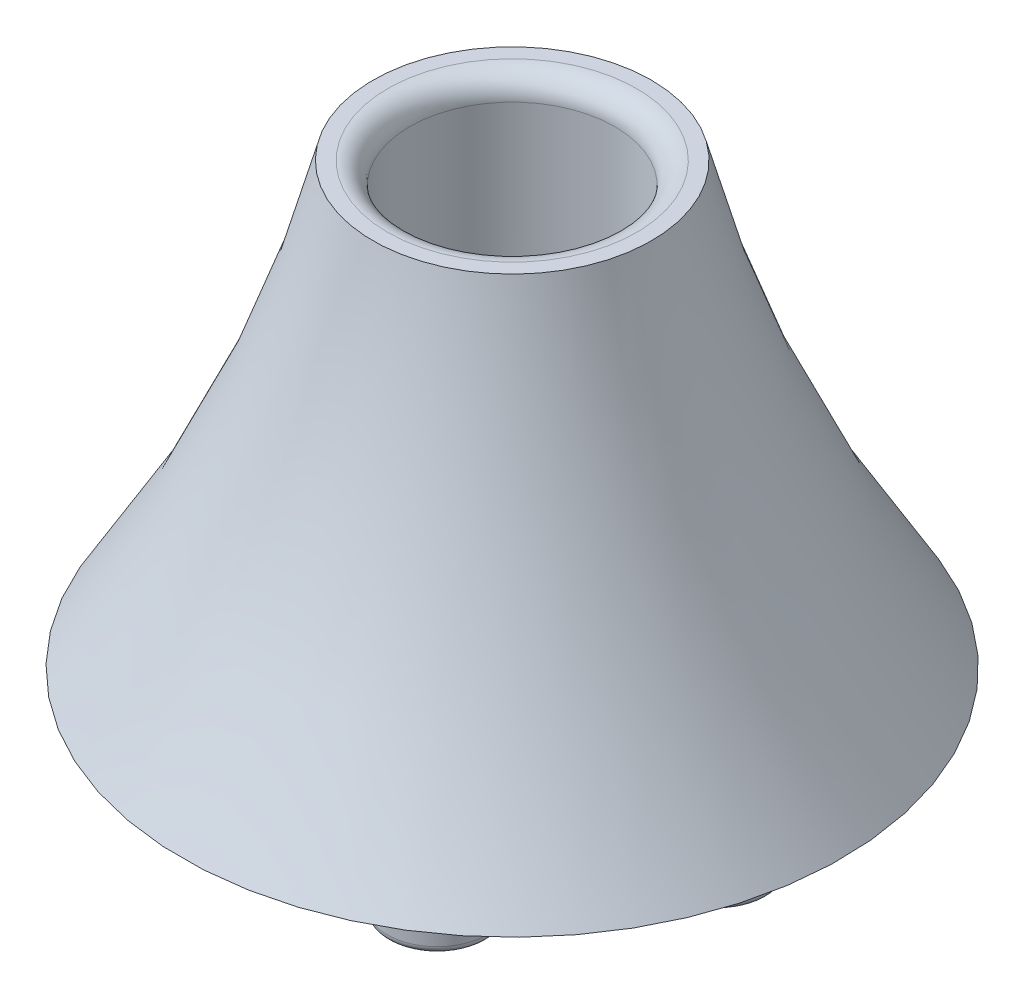
ISO-10303-21;
HEADER;
FILE_DESCRIPTION(('STEP AP214'),'2;1');
FILE_NAME('part.step','',(''),(''),'','','');
FILE_SCHEMA(('AUTOMOTIVE_DESIGN { 1 0 10303 214 1 1 1 1 }'));
ENDSEC;
DATA;
#1=APPLICATION_CONTEXT('core data for automotive mechanical design processes');
#2=APPLICATION_PROTOCOL_DEFINITION('international standard','automotive_design',2000,#1);
#3=PRODUCT_CONTEXT('',#1,'mechanical');
#4=PRODUCT('Part','Part','',(#3));
#5=PRODUCT_RELATED_PRODUCT_CATEGORY('part','',(#4));
#6=PRODUCT_DEFINITION_FORMATION('','',#4);
#7=PRODUCT_DEFINITION_CONTEXT('part definition',#1,'design');
#8=PRODUCT_DEFINITION('design','',#6,#7);
#9=PRODUCT_DEFINITION_SHAPE('','',#8);
#10=(LENGTH_UNIT() NAMED_UNIT(*) SI_UNIT(.MILLI.,.METRE.));
#11=(NAMED_UNIT(*) PLANE_ANGLE_UNIT() SI_UNIT($,.RADIAN.));
#12=(NAMED_UNIT(*) SI_UNIT($,.STERADIAN.) SOLID_ANGLE_UNIT());
#13=UNCERTAINTY_MEASURE_WITH_UNIT(LENGTH_MEASURE(1.E-05),#10,'distance_accuracy_value','');
#14=(GEOMETRIC_REPRESENTATION_CONTEXT(3) GLOBAL_UNCERTAINTY_ASSIGNED_CONTEXT((#13)) GLOBAL_UNIT_ASSIGNED_CONTEXT((#10,
#11,#12)) REPRESENTATION_CONTEXT('',''));
#15=CARTESIAN_POINT('',(0.,0.,0.));
#16=DIRECTION('',(0.,0.,1.));
#17=DIRECTION('',(1.,0.,0.));
#18=AXIS2_PLACEMENT_3D('',#15,#16,#17);
#19=CARTESIAN_POINT('',(0.,30.,0.));
#20=DIRECTION('',(0.,1.,0.));
#21=DIRECTION('',(0.,0.,1.));
#22=AXIS2_PLACEMENT_3D('',#19,#20,#21);
#23=PLANE('',#22);
#24=CARTESIAN_POINT('',(0.,30.,0.));
#25=DIRECTION('',(0.,1.,0.));
#26=DIRECTION('',(0.,0.,1.));
#27=AXIS2_PLACEMENT_3D('',#24,#25,#26);
#28=CIRCLE('',#27,8.5);
#29=CARTESIAN_POINT('',(0.,30.,8.5));
#30=VERTEX_POINT('',#29);
#31=EDGE_CURVE('E85',#30,#30,#28,.F.);
#32=ORIENTED_EDGE('',*,*,#31,.T.);
#33=EDGE_LOOP('',(#32));
#34=FACE_BOUND('',#33,.T.);
#35=CARTESIAN_POINT('',(0.,30.,0.));
#36=DIRECTION('',(0.,-1.,0.));
#37=DIRECTION('',(0.,0.,-1.));
#38=AXIS2_PLACEMENT_3D('',#35,#36,#37);
#39=CIRCLE('',#38,9.5);
#40=CARTESIAN_POINT('',(0.,30.,-9.5));
#41=VERTEX_POINT('',#40);
#42=EDGE_CURVE('E88',#41,#41,#39,.T.);
#43=ORIENTED_EDGE('',*,*,#42,.F.);
#44=EDGE_LOOP('',(#43));
#45=FACE_BOUND('',#44,.T.);
#46=ADVANCED_FACE('F32',(#34,#45),#23,.T.);
#47=CARTESIAN_POINT('',(0.,51.750888593495,0.));
#48=DIRECTION('',(0.,-1.,0.));
#49=DIRECTION('',(0.,0.,-1.));
#50=AXIS2_PLACEMENT_3D('',#47,#48,#49);
#51=TOROIDAL_SURFACE('',#50,100.809742908065,93.8646382006751);
#52=CARTESIAN_POINT('',(0.,0.,0.));
#53=DIRECTION('',(0.,-1.,0.));
#54=DIRECTION('',(0.,0.,-1.));
#55=AXIS2_PLACEMENT_3D('',#52,#53,#54);
#56=CIRCLE('',#55,22.5);
#57=CARTESIAN_POINT('',(0.,0.,-22.5));
#58=VERTEX_POINT('',#57);
#59=EDGE_CURVE('E91',#58,#58,#56,.T.);
#60=ORIENTED_EDGE('',*,*,#59,.F.);
#61=EDGE_LOOP('',(#60));
#62=FACE_BOUND('',#61,.T.);
#63=ORIENTED_EDGE('',*,*,#42,.T.);
#64=EDGE_LOOP('',(#63));
#65=FACE_BOUND('',#64,.T.);
#66=ADVANCED_FACE('F119',(#62,#65),#51,.F.);
#67=CARTESIAN_POINT('',(0.,0.,0.));
#68=DIRECTION('',(0.,-1.,0.));
#69=DIRECTION('',(0.,0.,-1.));
#70=AXIS2_PLACEMENT_3D('',#67,#68,#69);
#71=PLANE('',#70);
#72=CARTESIAN_POINT('',(0.,0.,0.));
#73=DIRECTION('',(0.,-1.,0.));
#74=DIRECTION('',(0.,0.,-1.));
#75=AXIS2_PLACEMENT_3D('',#72,#73,#74);
#76=CIRCLE('',#75,8.5);
#77=CARTESIAN_POINT('',(0.,0.,-8.5));
#78=VERTEX_POINT('',#77);
#79=EDGE_CURVE('E76',#78,#78,#76,.F.);
#80=ORIENTED_EDGE('',*,*,#79,.T.);
#81=EDGE_LOOP('',(#80));
#82=FACE_BOUND('',#81,.T.);
#83=CARTESIAN_POINT('',(6.99999999999997,0.,-12.1243556529822));
#84=DIRECTION('',(0.,-1.,0.));
#85=DIRECTION('',(0.,0.,-1.));
#86=AXIS2_PLACEMENT_3D('',#83,#84,#85);
#87=CIRCLE('',#86,3.4);
#88=CARTESIAN_POINT('',(6.99999999999997,0.,-15.5243556529822));
#89=VERTEX_POINT('',#88);
#90=EDGE_CURVE('E109',#89,#89,#87,.T.);
#91=ORIENTED_EDGE('',*,*,#90,.F.);
#92=EDGE_LOOP('',(#91));
#93=FACE_BOUND('',#92,.T.);
#94=CARTESIAN_POINT('',(-7.00000000000006,0.,-12.1243556529821));
#95=DIRECTION('',(0.,-1.,0.));
#96=DIRECTION('',(0.,0.,-1.));
#97=AXIS2_PLACEMENT_3D('',#94,#95,#96);
#98=CIRCLE('',#97,3.4);
#99=CARTESIAN_POINT('',(-7.00000000000006,0.,-15.5243556529821));
#100=VERTEX_POINT('',#99);
#101=EDGE_CURVE('E106',#100,#100,#98,.T.);
#102=ORIENTED_EDGE('',*,*,#101,.F.);
#103=EDGE_LOOP('',(#102));
#104=FACE_BOUND('',#103,.T.);
#105=CARTESIAN_POINT('',(-14.,0.,0.));
#106=DIRECTION('',(0.,-1.,0.));
#107=DIRECTION('',(0.,0.,-1.));
#108=AXIS2_PLACEMENT_3D('',#105,#106,#107);
#109=CIRCLE('',#108,3.4);
#110=CARTESIAN_POINT('',(-14.,0.,-3.3999999999999));
#111=VERTEX_POINT('',#110);
#112=EDGE_CURVE('E103',#111,#111,#109,.T.);
#113=ORIENTED_EDGE('',*,*,#112,.F.);
#114=EDGE_LOOP('',(#113));
#115=FACE_BOUND('',#114,.T.);
#116=CARTESIAN_POINT('',(-6.99999999999989,0.,12.1243556529822));
#117=DIRECTION('',(0.,-1.,0.));
#118=DIRECTION('',(0.,0.,-1.));
#119=AXIS2_PLACEMENT_3D('',#116,#117,#118);
#120=CIRCLE('',#119,3.4);
#121=CARTESIAN_POINT('',(-6.99999999999989,0.,8.72435565298221));
#122=VERTEX_POINT('',#121);
#123=EDGE_CURVE('E100',#122,#122,#120,.T.);
#124=ORIENTED_EDGE('',*,*,#123,.F.);
#125=EDGE_LOOP('',(#124));
#126=FACE_BOUND('',#125,.T.);
#127=CARTESIAN_POINT('',(7.00000000000014,0.,12.1243556529821));
#128=DIRECTION('',(0.,-1.,0.));
#129=DIRECTION('',(0.,0.,-1.));
#130=AXIS2_PLACEMENT_3D('',#127,#128,#129);
#131=CIRCLE('',#130,3.4);
#132=CARTESIAN_POINT('',(7.00000000000014,0.,8.72435565298206));
#133=VERTEX_POINT('',#132);
#134=EDGE_CURVE('E97',#133,#133,#131,.T.);
#135=ORIENTED_EDGE('',*,*,#134,.F.);
#136=EDGE_LOOP('',(#135));
#137=FACE_BOUND('',#136,.T.);
#138=CARTESIAN_POINT('',(14.,0.,0.));
#139=DIRECTION('',(0.,-1.,0.));
#140=DIRECTION('',(0.,0.,-1.));
#141=AXIS2_PLACEMENT_3D('',#138,#139,#140);
#142=CIRCLE('',#141,3.4);
#143=CARTESIAN_POINT('',(14.,0.,-3.4));
#144=VERTEX_POINT('',#143);
#145=EDGE_CURVE('E94',#144,#144,#142,.T.);
#146=ORIENTED_EDGE('',*,*,#145,.F.);
#147=EDGE_LOOP('',(#146));
#148=FACE_BOUND('',#147,.T.);
#149=ORIENTED_EDGE('',*,*,#59,.T.);
#150=EDGE_LOOP('',(#149));
#151=FACE_BOUND('',#150,.T.);
#152=ADVANCED_FACE('F115',(#82,#93,#104,#115,#126,#137,#148,#151),#71,.T.);
#153=CARTESIAN_POINT('',(0.,0.,0.));
#154=DIRECTION('',(0.,-1.,0.));
#155=DIRECTION('',(0.,0.,-1.));
#156=AXIS2_PLACEMENT_3D('',#153,#154,#155);
#157=CYLINDRICAL_SURFACE('',#156,7.);
#158=CARTESIAN_POINT('',(0.,1.5,0.));
#159=DIRECTION('',(0.,-1.,0.));
#160=DIRECTION('',(0.,0.,-1.));
#161=AXIS2_PLACEMENT_3D('',#158,#159,#160);
#162=CIRCLE('',#161,7.);
#163=CARTESIAN_POINT('',(0.,1.5,-7.));
#164=VERTEX_POINT('',#163);
#165=EDGE_CURVE('E79',#164,#164,#162,.T.);
#166=ORIENTED_EDGE('',*,*,#165,.T.);
#167=EDGE_LOOP('',(#166));
#168=FACE_BOUND('',#167,.T.);
#169=CARTESIAN_POINT('',(0.,28.5,0.));
#170=DIRECTION('',(0.,1.,0.));
#171=DIRECTION('',(0.,0.,1.));
#172=AXIS2_PLACEMENT_3D('',#169,#170,#171);
#173=CIRCLE('',#172,7.);
#174=CARTESIAN_POINT('',(0.,28.5,7.));
#175=VERTEX_POINT('',#174);
#176=EDGE_CURVE('E82',#175,#175,#173,.T.);
#177=ORIENTED_EDGE('',*,*,#176,.T.);
#178=EDGE_LOOP('',(#177));
#179=FACE_BOUND('',#178,.T.);
#180=ADVANCED_FACE('F118',(#168,#179),#157,.F.);
#181=CARTESIAN_POINT('',(14.,-5.,0.));
#182=DIRECTION('',(0.,1.,0.));
#183=DIRECTION('',(0.,0.,1.));
#184=AXIS2_PLACEMENT_3D('',#181,#182,#183);
#185=CYLINDRICAL_SURFACE('',#184,3.4);
#186=CARTESIAN_POINT('',(14.,-4.5,0.));
#187=DIRECTION('',(0.,-1.,0.));
#188=DIRECTION('',(0.,0.,-1.));
#189=AXIS2_PLACEMENT_3D('',#186,#187,#188);
#190=CIRCLE('',#189,3.4);
#191=CARTESIAN_POINT('',(14.,-4.5,-3.4));
#192=VERTEX_POINT('',#191);
#193=EDGE_CURVE('E58',#192,#192,#190,.F.);
#194=ORIENTED_EDGE('',*,*,#193,.T.);
#195=EDGE_LOOP('',(#194));
#196=FACE_BOUND('',#195,.T.);
#197=ORIENTED_EDGE('',*,*,#145,.T.);
#198=EDGE_LOOP('',(#197));
#199=FACE_BOUND('',#198,.T.);
#200=ADVANCED_FACE('F219',(#196,#199),#185,.T.);
#201=CARTESIAN_POINT('',(0.,-5.,0.));
#202=DIRECTION('',(0.,-1.,0.));
#203=DIRECTION('',(0.,0.,-1.));
#204=AXIS2_PLACEMENT_3D('',#201,#202,#203);
#205=PLANE('',#204);
#206=CARTESIAN_POINT('',(14.,-5.,0.));
#207=DIRECTION('',(0.,-1.,0.));
#208=DIRECTION('',(0.,0.,-1.));
#209=AXIS2_PLACEMENT_3D('',#206,#207,#208);
#210=CIRCLE('',#209,2.9);
#211=CARTESIAN_POINT('',(14.,-5.,-2.9));
#212=VERTEX_POINT('',#211);
#213=EDGE_CURVE('E61',#212,#212,#210,.T.);
#214=ORIENTED_EDGE('',*,*,#213,.T.);
#215=EDGE_LOOP('',(#214));
#216=FACE_BOUND('',#215,.T.);
#217=ADVANCED_FACE('F215',(#216),#205,.T.);
#218=CARTESIAN_POINT('',(7.00000000000014,-5.,12.1243556529821));
#219=DIRECTION('',(0.,1.,0.));
#220=DIRECTION('',(0.,0.,1.));
#221=AXIS2_PLACEMENT_3D('',#218,#219,#220);
#222=CYLINDRICAL_SURFACE('',#221,3.4);
#223=CARTESIAN_POINT('',(7.00000000000014,-4.5,12.1243556529821));
#224=DIRECTION('',(0.,-1.,0.));
#225=DIRECTION('',(0.,0.,-1.));
#226=AXIS2_PLACEMENT_3D('',#223,#224,#225);
#227=CIRCLE('',#226,3.4);
#228=CARTESIAN_POINT('',(7.00000000000014,-4.5,8.72435565298206));
#229=VERTEX_POINT('',#228);
#230=EDGE_CURVE('E64',#229,#229,#227,.F.);
#231=ORIENTED_EDGE('',*,*,#230,.T.);
#232=EDGE_LOOP('',(#231));
#233=FACE_BOUND('',#232,.T.);
#234=ORIENTED_EDGE('',*,*,#134,.T.);
#235=EDGE_LOOP('',(#234));
#236=FACE_BOUND('',#235,.T.);
#237=ADVANCED_FACE('F211',(#233,#236),#222,.T.);
#238=CARTESIAN_POINT('',(0.,-5.,0.));
#239=DIRECTION('',(0.,-1.,0.));
#240=DIRECTION('',(0.,0.,-1.));
#241=AXIS2_PLACEMENT_3D('',#238,#239,#240);
#242=PLANE('',#241);
#243=CARTESIAN_POINT('',(7.00000000000014,-5.,12.1243556529821));
#244=DIRECTION('',(0.,-1.,0.));
#245=DIRECTION('',(0.,0.,-1.));
#246=AXIS2_PLACEMENT_3D('',#243,#244,#245);
#247=CIRCLE('',#246,2.9);
#248=CARTESIAN_POINT('',(7.00000000000014,-5.,9.22435565298206));
#249=VERTEX_POINT('',#248);
#250=EDGE_CURVE('E67',#249,#249,#247,.T.);
#251=ORIENTED_EDGE('',*,*,#250,.T.);
#252=EDGE_LOOP('',(#251));
#253=FACE_BOUND('',#252,.T.);
#254=ADVANCED_FACE('F207',(#253),#242,.T.);
#255=CARTESIAN_POINT('',(-6.99999999999989,-5.,12.1243556529822));
#256=DIRECTION('',(0.,1.,0.));
#257=DIRECTION('',(0.,0.,1.));
#258=AXIS2_PLACEMENT_3D('',#255,#256,#257);
#259=CYLINDRICAL_SURFACE('',#258,3.4);
#260=CARTESIAN_POINT('',(-6.99999999999989,-4.5,12.1243556529822));
#261=DIRECTION('',(0.,-1.,0.));
#262=DIRECTION('',(0.,0.,-1.));
#263=AXIS2_PLACEMENT_3D('',#260,#261,#262);
#264=CIRCLE('',#263,3.4);
#265=CARTESIAN_POINT('',(-6.99999999999989,-4.5,8.72435565298221));
#266=VERTEX_POINT('',#265);
#267=EDGE_CURVE('E70',#266,#266,#264,.F.);
#268=ORIENTED_EDGE('',*,*,#267,.T.);
#269=EDGE_LOOP('',(#268));
#270=FACE_BOUND('',#269,.T.);
#271=ORIENTED_EDGE('',*,*,#123,.T.);
#272=EDGE_LOOP('',(#271));
#273=FACE_BOUND('',#272,.T.);
#274=ADVANCED_FACE('F203',(#270,#273),#259,.T.);
#275=CARTESIAN_POINT('',(0.,-5.,0.));
#276=DIRECTION('',(0.,-1.,0.));
#277=DIRECTION('',(0.,0.,-1.));
#278=AXIS2_PLACEMENT_3D('',#275,#276,#277);
#279=PLANE('',#278);
#280=CARTESIAN_POINT('',(-6.99999999999989,-5.,12.1243556529822));
#281=DIRECTION('',(0.,-1.,0.));
#282=DIRECTION('',(0.,0.,-1.));
#283=AXIS2_PLACEMENT_3D('',#280,#281,#282);
#284=CIRCLE('',#283,2.9);
#285=CARTESIAN_POINT('',(-6.99999999999989,-5.,9.22435565298221));
#286=VERTEX_POINT('',#285);
#287=EDGE_CURVE('E73',#286,#286,#284,.T.);
#288=ORIENTED_EDGE('',*,*,#287,.T.);
#289=EDGE_LOOP('',(#288));
#290=FACE_BOUND('',#289,.T.);
#291=ADVANCED_FACE('F200',(#290),#279,.T.);
#292=CARTESIAN_POINT('',(-14.,-5.,0.));
#293=DIRECTION('',(0.,1.,0.));
#294=DIRECTION('',(0.,0.,1.));
#295=AXIS2_PLACEMENT_3D('',#292,#293,#294);
#296=CYLINDRICAL_SURFACE('',#295,3.4);
#297=CARTESIAN_POINT('',(-14.,-4.5,0.));
#298=DIRECTION('',(0.,-1.,0.));
#299=DIRECTION('',(0.,0.,-1.));
#300=AXIS2_PLACEMENT_3D('',#297,#298,#299);
#301=CIRCLE('',#300,3.4);
#302=CARTESIAN_POINT('',(-14.,-4.5,-3.3999999999999));
#303=VERTEX_POINT('',#302);
#304=EDGE_CURVE('E10',#303,#303,#301,.F.);
#305=ORIENTED_EDGE('',*,*,#304,.T.);
#306=EDGE_LOOP('',(#305));
#307=FACE_BOUND('',#306,.T.);
#308=ORIENTED_EDGE('',*,*,#112,.T.);
#309=EDGE_LOOP('',(#308));
#310=FACE_BOUND('',#309,.T.);
#311=ADVANCED_FACE('F197',(#307,#310),#296,.T.);
#312=CARTESIAN_POINT('',(0.,-5.,0.));
#313=DIRECTION('',(0.,-1.,0.));
#314=DIRECTION('',(0.,0.,-1.));
#315=AXIS2_PLACEMENT_3D('',#312,#313,#314);
#316=PLANE('',#315);
#317=CARTESIAN_POINT('',(-14.,-5.,0.));
#318=DIRECTION('',(0.,-1.,0.));
#319=DIRECTION('',(0.,0.,-1.));
#320=AXIS2_PLACEMENT_3D('',#317,#318,#319);
#321=CIRCLE('',#320,2.9);
#322=CARTESIAN_POINT('',(-14.,-5.,-2.8999999999999));
#323=VERTEX_POINT('',#322);
#324=EDGE_CURVE('E39',#323,#323,#321,.T.);
#325=ORIENTED_EDGE('',*,*,#324,.T.);
#326=EDGE_LOOP('',(#325));
#327=FACE_BOUND('',#326,.T.);
#328=ADVANCED_FACE('F190',(#327),#316,.T.);
#329=CARTESIAN_POINT('',(-7.00000000000006,-5.,-12.1243556529821));
#330=DIRECTION('',(0.,1.,0.));
#331=DIRECTION('',(0.,0.,1.));
#332=AXIS2_PLACEMENT_3D('',#329,#330,#331);
#333=CYLINDRICAL_SURFACE('',#332,3.4);
#334=CARTESIAN_POINT('',(-7.00000000000006,-4.5,-12.1243556529821));
#335=DIRECTION('',(0.,-1.,0.));
#336=DIRECTION('',(0.,0.,-1.));
#337=AXIS2_PLACEMENT_3D('',#334,#335,#336);
#338=CIRCLE('',#337,3.4);
#339=CARTESIAN_POINT('',(-7.00000000000006,-4.5,-15.5243556529821));
#340=VERTEX_POINT('',#339);
#341=EDGE_CURVE('E43',#340,#340,#338,.F.);
#342=ORIENTED_EDGE('',*,*,#341,.T.);
#343=EDGE_LOOP('',(#342));
#344=FACE_BOUND('',#343,.T.);
#345=ORIENTED_EDGE('',*,*,#101,.T.);
#346=EDGE_LOOP('',(#345));
#347=FACE_BOUND('',#346,.T.);
#348=ADVANCED_FACE('F182',(#344,#347),#333,.T.);
#349=CARTESIAN_POINT('',(0.,-5.,0.));
#350=DIRECTION('',(0.,-1.,0.));
#351=DIRECTION('',(0.,0.,-1.));
#352=AXIS2_PLACEMENT_3D('',#349,#350,#351);
#353=PLANE('',#352);
#354=CARTESIAN_POINT('',(-7.00000000000006,-5.,-12.1243556529821));
#355=DIRECTION('',(0.,-1.,0.));
#356=DIRECTION('',(0.,0.,-1.));
#357=AXIS2_PLACEMENT_3D('',#354,#355,#356);
#358=CIRCLE('',#357,2.9);
#359=CARTESIAN_POINT('',(-7.00000000000006,-5.,-15.0243556529821));
#360=VERTEX_POINT('',#359);
#361=EDGE_CURVE('E47',#360,#360,#358,.T.);
#362=ORIENTED_EDGE('',*,*,#361,.T.);
#363=EDGE_LOOP('',(#362));
#364=FACE_BOUND('',#363,.T.);
#365=ADVANCED_FACE('F180',(#364),#353,.T.);
#366=CARTESIAN_POINT('',(6.99999999999997,-5.,-12.1243556529822));
#367=DIRECTION('',(0.,1.,0.));
#368=DIRECTION('',(0.,0.,1.));
#369=AXIS2_PLACEMENT_3D('',#366,#367,#368);
#370=CYLINDRICAL_SURFACE('',#369,3.4);
#371=CARTESIAN_POINT('',(6.99999999999997,-4.5,-12.1243556529822));
#372=DIRECTION('',(0.,-1.,0.));
#373=DIRECTION('',(0.,0.,-1.));
#374=AXIS2_PLACEMENT_3D('',#371,#372,#373);
#375=CIRCLE('',#374,3.4);
#376=CARTESIAN_POINT('',(6.99999999999997,-4.5,-15.5243556529822));
#377=VERTEX_POINT('',#376);
#378=EDGE_CURVE('E52',#377,#377,#375,.F.);
#379=ORIENTED_EDGE('',*,*,#378,.T.);
#380=EDGE_LOOP('',(#379));
#381=FACE_BOUND('',#380,.T.);
#382=ORIENTED_EDGE('',*,*,#90,.T.);
#383=EDGE_LOOP('',(#382));
#384=FACE_BOUND('',#383,.T.);
#385=ADVANCED_FACE('F113',(#381,#384),#370,.T.);
#386=CARTESIAN_POINT('',(0.,-5.,0.));
#387=DIRECTION('',(0.,-1.,0.));
#388=DIRECTION('',(0.,0.,-1.));
#389=AXIS2_PLACEMENT_3D('',#386,#387,#388);
#390=PLANE('',#389);
#391=CARTESIAN_POINT('',(6.99999999999997,-5.,-12.1243556529822));
#392=DIRECTION('',(0.,-1.,0.));
#393=DIRECTION('',(0.,0.,-1.));
#394=AXIS2_PLACEMENT_3D('',#391,#392,#393);
#395=CIRCLE('',#394,2.9);
#396=CARTESIAN_POINT('',(6.99999999999997,-5.,-15.0243556529822));
#397=VERTEX_POINT('',#396);
#398=EDGE_CURVE('E55',#397,#397,#395,.T.);
#399=ORIENTED_EDGE('',*,*,#398,.T.);
#400=EDGE_LOOP('',(#399));
#401=FACE_BOUND('',#400,.T.);
#402=ADVANCED_FACE('F149',(#401),#390,.T.);
#403=CARTESIAN_POINT('',(0.,28.5,0.));
#404=DIRECTION('',(0.,1.,0.));
#405=DIRECTION('',(0.,0.,1.));
#406=AXIS2_PLACEMENT_3D('',#403,#404,#405);
#407=TOROIDAL_SURFACE('',#406,8.5,1.5);
#408=ORIENTED_EDGE('',*,*,#176,.F.);
#409=EDGE_LOOP('',(#408));
#410=FACE_BOUND('',#409,.T.);
#411=ORIENTED_EDGE('',*,*,#31,.F.);
#412=EDGE_LOOP('',(#411));
#413=FACE_BOUND('',#412,.T.);
#414=ADVANCED_FACE('F145',(#410,#413),#407,.T.);
#415=CARTESIAN_POINT('',(0.,1.5,0.));
#416=DIRECTION('',(0.,-1.,0.));
#417=DIRECTION('',(0.,0.,-1.));
#418=AXIS2_PLACEMENT_3D('',#415,#416,#417);
#419=TOROIDAL_SURFACE('',#418,8.5,1.5);
#420=ORIENTED_EDGE('',*,*,#79,.F.);
#421=EDGE_LOOP('',(#420));
#422=FACE_BOUND('',#421,.T.);
#423=ORIENTED_EDGE('',*,*,#165,.F.);
#424=EDGE_LOOP('',(#423));
#425=FACE_BOUND('',#424,.T.);
#426=ADVANCED_FACE('F148',(#422,#425),#419,.T.);
#427=CARTESIAN_POINT('',(-6.99999999999989,-4.5,12.1243556529822));
#428=DIRECTION('',(0.,-1.,0.));
#429=DIRECTION('',(0.,0.,-1.));
#430=AXIS2_PLACEMENT_3D('',#427,#428,#429);
#431=TOROIDAL_SURFACE('',#430,2.9,0.5);
#432=ORIENTED_EDGE('',*,*,#267,.F.);
#433=EDGE_LOOP('',(#432));
#434=FACE_BOUND('',#433,.T.);
#435=ORIENTED_EDGE('',*,*,#287,.F.);
#436=EDGE_LOOP('',(#435));
#437=FACE_BOUND('',#436,.T.);
#438=ADVANCED_FACE('F153',(#434,#437),#431,.T.);
#439=CARTESIAN_POINT('',(7.00000000000014,-4.5,12.1243556529821));
#440=DIRECTION('',(0.,-1.,0.));
#441=DIRECTION('',(0.,0.,-1.));
#442=AXIS2_PLACEMENT_3D('',#439,#440,#441);
#443=TOROIDAL_SURFACE('',#442,2.9,0.5);
#444=ORIENTED_EDGE('',*,*,#230,.F.);
#445=EDGE_LOOP('',(#444));
#446=FACE_BOUND('',#445,.T.);
#447=ORIENTED_EDGE('',*,*,#250,.F.);
#448=EDGE_LOOP('',(#447));
#449=FACE_BOUND('',#448,.T.);
#450=ADVANCED_FACE('F157',(#446,#449),#443,.T.);
#451=CARTESIAN_POINT('',(14.,-4.5,0.));
#452=DIRECTION('',(0.,-1.,0.));
#453=DIRECTION('',(0.,0.,-1.));
#454=AXIS2_PLACEMENT_3D('',#451,#452,#453);
#455=TOROIDAL_SURFACE('',#454,2.9,0.5);
#456=ORIENTED_EDGE('',*,*,#193,.F.);
#457=EDGE_LOOP('',(#456));
#458=FACE_BOUND('',#457,.T.);
#459=ORIENTED_EDGE('',*,*,#213,.F.);
#460=EDGE_LOOP('',(#459));
#461=FACE_BOUND('',#460,.T.);
#462=ADVANCED_FACE('F161',(#458,#461),#455,.T.);
#463=CARTESIAN_POINT('',(6.99999999999997,-4.5,-12.1243556529822));
#464=DIRECTION('',(0.,-1.,0.));
#465=DIRECTION('',(0.,0.,-1.));
#466=AXIS2_PLACEMENT_3D('',#463,#464,#465);
#467=TOROIDAL_SURFACE('',#466,2.9,0.5);
#468=ORIENTED_EDGE('',*,*,#378,.F.);
#469=EDGE_LOOP('',(#468));
#470=FACE_BOUND('',#469,.T.);
#471=ORIENTED_EDGE('',*,*,#398,.F.);
#472=EDGE_LOOP('',(#471));
#473=FACE_BOUND('',#472,.T.);
#474=ADVANCED_FACE('F165',(#470,#473),#467,.T.);
#475=CARTESIAN_POINT('',(-7.00000000000006,-4.5,-12.1243556529821));
#476=DIRECTION('',(0.,-1.,0.));
#477=DIRECTION('',(0.,0.,-1.));
#478=AXIS2_PLACEMENT_3D('',#475,#476,#477);
#479=TOROIDAL_SURFACE('',#478,2.9,0.5);
#480=ORIENTED_EDGE('',*,*,#341,.F.);
#481=EDGE_LOOP('',(#480));
#482=FACE_BOUND('',#481,.T.);
#483=ORIENTED_EDGE('',*,*,#361,.F.);
#484=EDGE_LOOP('',(#483));
#485=FACE_BOUND('',#484,.T.);
#486=ADVANCED_FACE('F168',(#482,#485),#479,.T.);
#487=CARTESIAN_POINT('',(-14.,-4.5,0.));
#488=DIRECTION('',(0.,-1.,0.));
#489=DIRECTION('',(0.,0.,-1.));
#490=AXIS2_PLACEMENT_3D('',#487,#488,#489);
#491=TOROIDAL_SURFACE('',#490,2.9,0.5);
#492=ORIENTED_EDGE('',*,*,#304,.F.);
#493=EDGE_LOOP('',(#492));
#494=FACE_BOUND('',#493,.T.);
#495=ORIENTED_EDGE('',*,*,#324,.F.);
#496=EDGE_LOOP('',(#495));
#497=FACE_BOUND('',#496,.T.);
#498=ADVANCED_FACE('F34',(#494,#497),#491,.T.);
#499=CLOSED_SHELL('',(#46,#66,#152,#180,#200,#217,#237,#254,#274,#291,#311,#328,#348,#365,#385,
#402,#414,#426,#438,#450,#462,#474,#486,#498));
#500=MANIFOLD_SOLID_BREP('B2',#499);
#501=ADVANCED_BREP_SHAPE_REPRESENTATION('',(#18,#500),#14);
#502=SHAPE_DEFINITION_REPRESENTATION(#9,#501);
ENDSEC;
END-ISO-10303-21;
